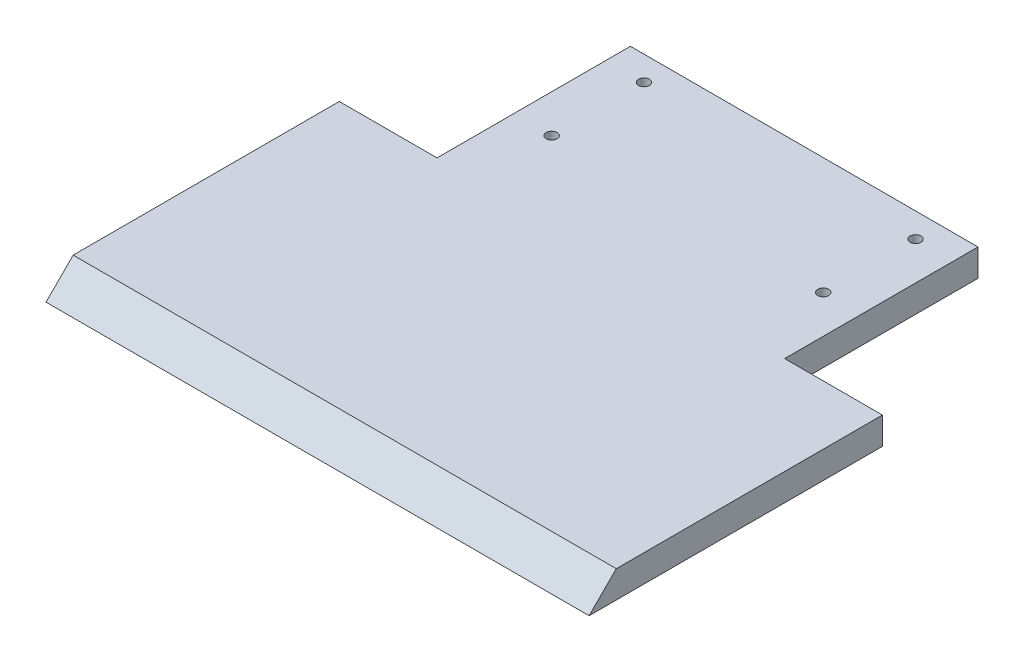
ISO-10303-21;
HEADER;
FILE_DESCRIPTION(('STEP AP214'),'2;1');
FILE_NAME('part.step','',(''),(''),'','','');
FILE_SCHEMA(('AUTOMOTIVE_DESIGN { 1 0 10303 214 1 1 1 1 }'));
ENDSEC;
DATA;
#1=APPLICATION_CONTEXT('core data for automotive mechanical design processes');
#2=APPLICATION_PROTOCOL_DEFINITION('international standard','automotive_design',2000,#1);
#3=PRODUCT_CONTEXT('',#1,'mechanical');
#4=PRODUCT('Part','Part','',(#3));
#5=PRODUCT_RELATED_PRODUCT_CATEGORY('part','',(#4));
#6=PRODUCT_DEFINITION_FORMATION('','',#4);
#7=PRODUCT_DEFINITION_CONTEXT('part definition',#1,'design');
#8=PRODUCT_DEFINITION('design','',#6,#7);
#9=PRODUCT_DEFINITION_SHAPE('','',#8);
#10=(LENGTH_UNIT() NAMED_UNIT(*) SI_UNIT(.MILLI.,.METRE.));
#11=(NAMED_UNIT(*) PLANE_ANGLE_UNIT() SI_UNIT($,.RADIAN.));
#12=(NAMED_UNIT(*) SI_UNIT($,.STERADIAN.) SOLID_ANGLE_UNIT());
#13=UNCERTAINTY_MEASURE_WITH_UNIT(LENGTH_MEASURE(1.E-05),#10,'distance_accuracy_value','');
#14=(GEOMETRIC_REPRESENTATION_CONTEXT(3) GLOBAL_UNCERTAINTY_ASSIGNED_CONTEXT((#13)) GLOBAL_UNIT_ASSIGNED_CONTEXT((#10,
#11,#12)) REPRESENTATION_CONTEXT('',''));
#15=CARTESIAN_POINT('',(0.,0.,0.));
#16=DIRECTION('',(0.,0.,1.));
#17=DIRECTION('',(1.,0.,0.));
#18=AXIS2_PLACEMENT_3D('',#15,#16,#17);
#19=CARTESIAN_POINT('',(0.,5.,0.));
#20=DIRECTION('',(1.,0.,0.));
#21=DIRECTION('',(0.,0.,-1.));
#22=AXIS2_PLACEMENT_3D('',#19,#20,#21);
#23=PLANE('',#22);
#24=DIRECTION('',(0.,0.,1.));
#25=VECTOR('',#24,1.);
#26=CARTESIAN_POINT('',(0.,5.,0.));
#27=LINE('',#26,#25);
#28=CARTESIAN_POINT('',(0.,5.,-54.));
#29=VERTEX_POINT('',#28);
#30=CARTESIAN_POINT('',(0.,5.,-5.));
#31=VERTEX_POINT('',#30);
#32=EDGE_CURVE('E134',#29,#31,#27,.T.);
#33=ORIENTED_EDGE('',*,*,#32,.F.);
#34=DIRECTION('',(0.,1.,0.));
#35=VECTOR('',#34,1.);
#36=CARTESIAN_POINT('',(0.,0.,-54.));
#37=LINE('',#36,#35);
#38=CARTESIAN_POINT('',(0.,0.,-54.));
#39=VERTEX_POINT('',#38);
#40=EDGE_CURVE('E125',#39,#29,#37,.T.);
#41=ORIENTED_EDGE('',*,*,#40,.F.);
#42=DIRECTION('',(0.,0.,1.));
#43=VECTOR('',#42,1.);
#44=CARTESIAN_POINT('',(0.,0.,0.));
#45=LINE('',#44,#43);
#46=CARTESIAN_POINT('',(0.,0.,0.));
#47=VERTEX_POINT('',#46);
#48=EDGE_CURVE('E141',#39,#47,#45,.T.);
#49=ORIENTED_EDGE('',*,*,#48,.T.);
#50=DIRECTION('',(0.,-0.707106781186549,0.707106781186547));
#51=VECTOR('',#50,1.);
#52=CARTESIAN_POINT('',(0.,5.,-5.));
#53=LINE('',#52,#51);
#54=EDGE_CURVE('E11',#47,#31,#53,.F.);
#55=ORIENTED_EDGE('',*,*,#54,.T.);
#56=EDGE_LOOP('',(#33,#41,#49,#55));
#57=FACE_BOUND('',#56,.T.);
#58=ADVANCED_FACE('F32',(#57),#23,.F.);
#59=CARTESIAN_POINT('',(100.,5.,0.));
#60=DIRECTION('',(-1.,0.,0.));
#61=DIRECTION('',(0.,0.,1.));
#62=AXIS2_PLACEMENT_3D('',#59,#60,#61);
#63=PLANE('',#62);
#64=DIRECTION('',(0.,0.,-1.));
#65=VECTOR('',#64,1.);
#66=CARTESIAN_POINT('',(100.,0.,0.));
#67=LINE('',#66,#65);
#68=CARTESIAN_POINT('',(100.,0.,0.));
#69=VERTEX_POINT('',#68);
#70=CARTESIAN_POINT('',(100.,0.,-54.));
#71=VERTEX_POINT('',#70);
#72=EDGE_CURVE('E137',#69,#71,#67,.T.);
#73=ORIENTED_EDGE('',*,*,#72,.T.);
#74=DIRECTION('',(0.,1.,0.));
#75=VECTOR('',#74,1.);
#76=CARTESIAN_POINT('',(100.,0.,-54.));
#77=LINE('',#76,#75);
#78=CARTESIAN_POINT('',(100.,5.,-54.));
#79=VERTEX_POINT('',#78);
#80=EDGE_CURVE('E129',#71,#79,#77,.T.);
#81=ORIENTED_EDGE('',*,*,#80,.T.);
#82=DIRECTION('',(0.,0.,-1.));
#83=VECTOR('',#82,1.);
#84=CARTESIAN_POINT('',(100.,5.,0.));
#85=LINE('',#84,#83);
#86=CARTESIAN_POINT('',(100.,5.,-5.));
#87=VERTEX_POINT('',#86);
#88=EDGE_CURVE('E136',#87,#79,#85,.T.);
#89=ORIENTED_EDGE('',*,*,#88,.F.);
#90=DIRECTION('',(0.,0.707106781186549,-0.707106781186547));
#91=VECTOR('',#90,1.);
#92=CARTESIAN_POINT('',(100.,5.00000000000001,-5.00000000000001));
#93=LINE('',#92,#91);
#94=EDGE_CURVE('E41',#87,#69,#93,.F.);
#95=ORIENTED_EDGE('',*,*,#94,.T.);
#96=EDGE_LOOP('',(#73,#81,#89,#95));
#97=FACE_BOUND('',#96,.T.);
#98=ADVANCED_FACE('F214',(#97),#63,.F.);
#99=CARTESIAN_POINT('',(0.,5.,0.));
#100=DIRECTION('',(0.,-1.,0.));
#101=DIRECTION('',(0.,0.,-1.));
#102=AXIS2_PLACEMENT_3D('',#99,#100,#101);
#103=PLANE('',#102);
#104=CARTESIAN_POINT('',(25.,5.,-68.1));
#105=DIRECTION('',(0.,1.,0.));
#106=DIRECTION('',(0.,0.,1.));
#107=AXIS2_PLACEMENT_3D('',#104,#105,#106);
#108=CIRCLE('',#107,1.);
#109=CARTESIAN_POINT('',(25.,5.,-67.1));
#110=VERTEX_POINT('',#109);
#111=EDGE_CURVE('E185',#110,#110,#108,.T.);
#112=ORIENTED_EDGE('',*,*,#111,.F.);
#113=EDGE_LOOP('',(#112));
#114=FACE_BOUND('',#113,.T.);
#115=CARTESIAN_POINT('',(75.,5.,-85.1));
#116=DIRECTION('',(0.,1.,0.));
#117=DIRECTION('',(0.,0.,1.));
#118=AXIS2_PLACEMENT_3D('',#115,#116,#117);
#119=CIRCLE('',#118,0.999999999999998);
#120=CARTESIAN_POINT('',(75.,5.,-84.1));
#121=VERTEX_POINT('',#120);
#122=EDGE_CURVE('E188',#121,#121,#119,.T.);
#123=ORIENTED_EDGE('',*,*,#122,.F.);
#124=EDGE_LOOP('',(#123));
#125=FACE_BOUND('',#124,.T.);
#126=CARTESIAN_POINT('',(75.,5.,-68.1));
#127=DIRECTION('',(0.,1.,0.));
#128=DIRECTION('',(0.,0.,1.));
#129=AXIS2_PLACEMENT_3D('',#126,#127,#128);
#130=CIRCLE('',#129,0.999999999999998);
#131=CARTESIAN_POINT('',(75.,5.,-67.1));
#132=VERTEX_POINT('',#131);
#133=EDGE_CURVE('E220',#132,#132,#130,.T.);
#134=ORIENTED_EDGE('',*,*,#133,.F.);
#135=EDGE_LOOP('',(#134));
#136=FACE_BOUND('',#135,.T.);
#137=CARTESIAN_POINT('',(25.,5.,-85.1));
#138=DIRECTION('',(0.,1.,0.));
#139=DIRECTION('',(0.,0.,1.));
#140=AXIS2_PLACEMENT_3D('',#137,#138,#139);
#141=CIRCLE('',#140,1.);
#142=CARTESIAN_POINT('',(25.,5.,-84.1));
#143=VERTEX_POINT('',#142);
#144=EDGE_CURVE('E156',#143,#143,#141,.T.);
#145=ORIENTED_EDGE('',*,*,#144,.F.);
#146=EDGE_LOOP('',(#145));
#147=FACE_BOUND('',#146,.T.);
#148=DIRECTION('',(0.,0.,1.));
#149=VECTOR('',#148,1.);
#150=CARTESIAN_POINT('',(82.,5.,-99.2));
#151=LINE('',#150,#149);
#152=CARTESIAN_POINT('',(82.,5.,-89.6));
#153=VERTEX_POINT('',#152);
#154=CARTESIAN_POINT('',(82.,5.,-54.));
#155=VERTEX_POINT('',#154);
#156=EDGE_CURVE('E122',#153,#155,#151,.T.);
#157=ORIENTED_EDGE('',*,*,#156,.F.);
#158=DIRECTION('',(1.,0.,0.));
#159=VECTOR('',#158,1.);
#160=CARTESIAN_POINT('',(18.,5.,-89.6));
#161=LINE('',#160,#159);
#162=CARTESIAN_POINT('',(18.,5.,-89.6));
#163=VERTEX_POINT('',#162);
#164=EDGE_CURVE('E100',#163,#153,#161,.T.);
#165=ORIENTED_EDGE('',*,*,#164,.F.);
#166=DIRECTION('',(0.,0.,-1.));
#167=VECTOR('',#166,1.);
#168=CARTESIAN_POINT('',(18.,5.,-99.2));
#169=LINE('',#168,#167);
#170=CARTESIAN_POINT('',(18.,5.,-54.));
#171=VERTEX_POINT('',#170);
#172=EDGE_CURVE('E194',#171,#163,#169,.T.);
#173=ORIENTED_EDGE('',*,*,#172,.F.);
#174=DIRECTION('',(1.,0.,0.));
#175=VECTOR('',#174,1.);
#176=CARTESIAN_POINT('',(0.,5.,-54.));
#177=LINE('',#176,#175);
#178=EDGE_CURVE('E132',#29,#171,#177,.T.);
#179=ORIENTED_EDGE('',*,*,#178,.F.);
#180=ORIENTED_EDGE('',*,*,#32,.T.);
#181=DIRECTION('',(1.,0.,0.));
#182=VECTOR('',#181,1.);
#183=CARTESIAN_POINT('',(0.,5.,-5.));
#184=LINE('',#183,#182);
#185=EDGE_CURVE('E140',#31,#87,#184,.T.);
#186=ORIENTED_EDGE('',*,*,#185,.T.);
#187=ORIENTED_EDGE('',*,*,#88,.T.);
#188=DIRECTION('',(1.,0.,0.));
#189=VECTOR('',#188,1.);
#190=CARTESIAN_POINT('',(100.,5.,-54.));
#191=LINE('',#190,#189);
#192=EDGE_CURVE('E119',#155,#79,#191,.T.);
#193=ORIENTED_EDGE('',*,*,#192,.F.);
#194=EDGE_LOOP('',(#157,#165,#173,#179,#180,#186,#187,#193));
#195=FACE_BOUND('',#194,.T.);
#196=ADVANCED_FACE('F169',(#114,#125,#136,#147,#195),#103,.F.);
#197=CARTESIAN_POINT('',(0.,0.,0.));
#198=DIRECTION('',(0.,-1.,0.));
#199=DIRECTION('',(0.,0.,-1.));
#200=AXIS2_PLACEMENT_3D('',#197,#198,#199);
#201=PLANE('',#200);
#202=DIRECTION('',(1.,0.,0.));
#203=VECTOR('',#202,1.);
#204=CARTESIAN_POINT('',(18.,0.,-89.6));
#205=LINE('',#204,#203);
#206=CARTESIAN_POINT('',(18.,0.,-89.6));
#207=VERTEX_POINT('',#206);
#208=CARTESIAN_POINT('',(82.,0.,-89.6));
#209=VERTEX_POINT('',#208);
#210=EDGE_CURVE('E49',#207,#209,#205,.T.);
#211=ORIENTED_EDGE('',*,*,#210,.T.);
#212=DIRECTION('',(0.,0.,1.));
#213=VECTOR('',#212,1.);
#214=CARTESIAN_POINT('',(82.,0.,-99.2));
#215=LINE('',#214,#213);
#216=CARTESIAN_POINT('',(82.,0.,-54.));
#217=VERTEX_POINT('',#216);
#218=EDGE_CURVE('E110',#209,#217,#215,.T.);
#219=ORIENTED_EDGE('',*,*,#218,.T.);
#220=DIRECTION('',(1.,0.,0.));
#221=VECTOR('',#220,1.);
#222=CARTESIAN_POINT('',(100.,0.,-54.));
#223=LINE('',#222,#221);
#224=EDGE_CURVE('E118',#217,#71,#223,.T.);
#225=ORIENTED_EDGE('',*,*,#224,.T.);
#226=ORIENTED_EDGE('',*,*,#72,.F.);
#227=DIRECTION('',(1.,0.,0.));
#228=VECTOR('',#227,1.);
#229=CARTESIAN_POINT('',(0.,0.,0.));
#230=LINE('',#229,#228);
#231=EDGE_CURVE('E143',#47,#69,#230,.T.);
#232=ORIENTED_EDGE('',*,*,#231,.F.);
#233=ORIENTED_EDGE('',*,*,#48,.F.);
#234=DIRECTION('',(1.,0.,0.));
#235=VECTOR('',#234,1.);
#236=CARTESIAN_POINT('',(0.,0.,-54.));
#237=LINE('',#236,#235);
#238=CARTESIAN_POINT('',(18.,0.,-54.));
#239=VERTEX_POINT('',#238);
#240=EDGE_CURVE('E192',#39,#239,#237,.T.);
#241=ORIENTED_EDGE('',*,*,#240,.T.);
#242=DIRECTION('',(0.,0.,-1.));
#243=VECTOR('',#242,1.);
#244=CARTESIAN_POINT('',(18.,0.,-99.2));
#245=LINE('',#244,#243);
#246=EDGE_CURVE('E56',#239,#207,#245,.T.);
#247=ORIENTED_EDGE('',*,*,#246,.T.);
#248=EDGE_LOOP('',(#211,#219,#225,#226,#232,#233,#241,#247));
#249=FACE_BOUND('',#248,.T.);
#250=CARTESIAN_POINT('',(25.,0.,-68.1));
#251=DIRECTION('',(0.,-1.,0.));
#252=DIRECTION('',(0.,0.,-1.));
#253=AXIS2_PLACEMENT_3D('',#250,#251,#252);
#254=CIRCLE('',#253,1.);
#255=CARTESIAN_POINT('',(25.,0.,-69.1));
#256=VERTEX_POINT('',#255);
#257=EDGE_CURVE('E36',#256,#256,#254,.T.);
#258=ORIENTED_EDGE('',*,*,#257,.F.);
#259=EDGE_LOOP('',(#258));
#260=FACE_BOUND('',#259,.T.);
#261=CARTESIAN_POINT('',(75.,0.,-85.1));
#262=DIRECTION('',(0.,-1.,0.));
#263=DIRECTION('',(0.,0.,-1.));
#264=AXIS2_PLACEMENT_3D('',#261,#262,#263);
#265=CIRCLE('',#264,0.999999999999998);
#266=CARTESIAN_POINT('',(75.,0.,-86.1));
#267=VERTEX_POINT('',#266);
#268=EDGE_CURVE('E158',#267,#267,#265,.T.);
#269=ORIENTED_EDGE('',*,*,#268,.F.);
#270=EDGE_LOOP('',(#269));
#271=FACE_BOUND('',#270,.T.);
#272=CARTESIAN_POINT('',(75.,0.,-68.1));
#273=DIRECTION('',(0.,-1.,0.));
#274=DIRECTION('',(0.,0.,-1.));
#275=AXIS2_PLACEMENT_3D('',#272,#273,#274);
#276=CIRCLE('',#275,0.999999999999998);
#277=CARTESIAN_POINT('',(75.,0.,-69.1));
#278=VERTEX_POINT('',#277);
#279=EDGE_CURVE('E155',#278,#278,#276,.T.);
#280=ORIENTED_EDGE('',*,*,#279,.F.);
#281=EDGE_LOOP('',(#280));
#282=FACE_BOUND('',#281,.T.);
#283=CARTESIAN_POINT('',(25.,0.,-85.1));
#284=DIRECTION('',(0.,-1.,0.));
#285=DIRECTION('',(0.,0.,-1.));
#286=AXIS2_PLACEMENT_3D('',#283,#284,#285);
#287=CIRCLE('',#286,1.);
#288=CARTESIAN_POINT('',(25.,0.,-86.1));
#289=VERTEX_POINT('',#288);
#290=EDGE_CURVE('E152',#289,#289,#287,.T.);
#291=ORIENTED_EDGE('',*,*,#290,.F.);
#292=EDGE_LOOP('',(#291));
#293=FACE_BOUND('',#292,.T.);
#294=ADVANCED_FACE('F107',(#249,#260,#271,#282,#293),#201,.T.);
#295=CARTESIAN_POINT('',(0.,5.,-5.));
#296=DIRECTION('',(0.,-0.707106781186547,-0.707106781186549));
#297=DIRECTION('',(1.,0.,0.));
#298=AXIS2_PLACEMENT_3D('',#295,#296,#297);
#299=PLANE('',#298);
#300=ORIENTED_EDGE('',*,*,#54,.F.);
#301=ORIENTED_EDGE('',*,*,#231,.T.);
#302=ORIENTED_EDGE('',*,*,#94,.F.);
#303=ORIENTED_EDGE('',*,*,#185,.F.);
#304=EDGE_LOOP('',(#300,#301,#302,#303));
#305=FACE_BOUND('',#304,.T.);
#306=ADVANCED_FACE('F34',(#305),#299,.F.);
#307=CARTESIAN_POINT('',(100.,0.,-54.));
#308=DIRECTION('',(0.,0.,1.));
#309=DIRECTION('',(1.,0.,0.));
#310=AXIS2_PLACEMENT_3D('',#307,#308,#309);
#311=PLANE('',#310);
#312=ORIENTED_EDGE('',*,*,#192,.T.);
#313=ORIENTED_EDGE('',*,*,#80,.F.);
#314=ORIENTED_EDGE('',*,*,#224,.F.);
#315=DIRECTION('',(0.,1.,0.));
#316=VECTOR('',#315,1.);
#317=CARTESIAN_POINT('',(82.,0.,-54.));
#318=LINE('',#317,#316);
#319=EDGE_CURVE('E117',#217,#155,#318,.T.);
#320=ORIENTED_EDGE('',*,*,#319,.T.);
#321=EDGE_LOOP('',(#312,#313,#314,#320));
#322=FACE_BOUND('',#321,.T.);
#323=ADVANCED_FACE('F217',(#322),#311,.F.);
#324=CARTESIAN_POINT('',(82.,0.,-99.2));
#325=DIRECTION('',(-1.,0.,0.));
#326=DIRECTION('',(0.,0.,1.));
#327=AXIS2_PLACEMENT_3D('',#324,#325,#326);
#328=PLANE('',#327);
#329=ORIENTED_EDGE('',*,*,#218,.F.);
#330=DIRECTION('',(0.,1.,0.));
#331=VECTOR('',#330,1.);
#332=CARTESIAN_POINT('',(82.,0.,-89.6));
#333=LINE('',#332,#331);
#334=EDGE_CURVE('E97',#209,#153,#333,.T.);
#335=ORIENTED_EDGE('',*,*,#334,.T.);
#336=ORIENTED_EDGE('',*,*,#156,.T.);
#337=ORIENTED_EDGE('',*,*,#319,.F.);
#338=EDGE_LOOP('',(#329,#335,#336,#337));
#339=FACE_BOUND('',#338,.T.);
#340=ADVANCED_FACE('F115',(#339),#328,.F.);
#341=CARTESIAN_POINT('',(18.,0.,-99.2));
#342=DIRECTION('',(1.,0.,0.));
#343=DIRECTION('',(0.,0.,-1.));
#344=AXIS2_PLACEMENT_3D('',#341,#342,#343);
#345=PLANE('',#344);
#346=ORIENTED_EDGE('',*,*,#172,.T.);
#347=DIRECTION('',(0.,1.,0.));
#348=VECTOR('',#347,1.);
#349=CARTESIAN_POINT('',(18.,0.,-89.6));
#350=LINE('',#349,#348);
#351=EDGE_CURVE('E104',#207,#163,#350,.T.);
#352=ORIENTED_EDGE('',*,*,#351,.F.);
#353=ORIENTED_EDGE('',*,*,#246,.F.);
#354=DIRECTION('',(0.,1.,0.));
#355=VECTOR('',#354,1.);
#356=CARTESIAN_POINT('',(18.,0.,-54.));
#357=LINE('',#356,#355);
#358=EDGE_CURVE('E144',#239,#171,#357,.T.);
#359=ORIENTED_EDGE('',*,*,#358,.T.);
#360=EDGE_LOOP('',(#346,#352,#353,#359));
#361=FACE_BOUND('',#360,.T.);
#362=ADVANCED_FACE('F219',(#361),#345,.F.);
#363=CARTESIAN_POINT('',(0.,0.,-54.));
#364=DIRECTION('',(0.,0.,1.));
#365=DIRECTION('',(1.,0.,0.));
#366=AXIS2_PLACEMENT_3D('',#363,#364,#365);
#367=PLANE('',#366);
#368=ORIENTED_EDGE('',*,*,#178,.T.);
#369=ORIENTED_EDGE('',*,*,#358,.F.);
#370=ORIENTED_EDGE('',*,*,#240,.F.);
#371=ORIENTED_EDGE('',*,*,#40,.T.);
#372=EDGE_LOOP('',(#368,#369,#370,#371));
#373=FACE_BOUND('',#372,.T.);
#374=ADVANCED_FACE('F180',(#373),#367,.F.);
#375=CARTESIAN_POINT('',(25.,-5.,-85.1));
#376=DIRECTION('',(0.,1.,0.));
#377=DIRECTION('',(0.,0.,1.));
#378=AXIS2_PLACEMENT_3D('',#375,#376,#377);
#379=CYLINDRICAL_SURFACE('',#378,1.);
#380=ORIENTED_EDGE('',*,*,#290,.T.);
#381=EDGE_LOOP('',(#380));
#382=FACE_BOUND('',#381,.T.);
#383=ORIENTED_EDGE('',*,*,#144,.T.);
#384=EDGE_LOOP('',(#383));
#385=FACE_BOUND('',#384,.T.);
#386=ADVANCED_FACE('F176',(#382,#385),#379,.F.);
#387=CARTESIAN_POINT('',(75.,-5.,-68.1));
#388=DIRECTION('',(0.,1.,0.));
#389=DIRECTION('',(0.,0.,1.));
#390=AXIS2_PLACEMENT_3D('',#387,#388,#389);
#391=CYLINDRICAL_SURFACE('',#390,0.999999999999998);
#392=ORIENTED_EDGE('',*,*,#279,.T.);
#393=EDGE_LOOP('',(#392));
#394=FACE_BOUND('',#393,.T.);
#395=ORIENTED_EDGE('',*,*,#133,.T.);
#396=EDGE_LOOP('',(#395));
#397=FACE_BOUND('',#396,.T.);
#398=ADVANCED_FACE('F179',(#394,#397),#391,.F.);
#399=CARTESIAN_POINT('',(75.,-5.,-85.1));
#400=DIRECTION('',(0.,1.,0.));
#401=DIRECTION('',(0.,0.,1.));
#402=AXIS2_PLACEMENT_3D('',#399,#400,#401);
#403=CYLINDRICAL_SURFACE('',#402,0.999999999999998);
#404=ORIENTED_EDGE('',*,*,#268,.T.);
#405=EDGE_LOOP('',(#404));
#406=FACE_BOUND('',#405,.T.);
#407=ORIENTED_EDGE('',*,*,#122,.T.);
#408=EDGE_LOOP('',(#407));
#409=FACE_BOUND('',#408,.T.);
#410=ADVANCED_FACE('F229',(#406,#409),#403,.F.);
#411=CARTESIAN_POINT('',(25.,-5.,-68.1));
#412=DIRECTION('',(0.,1.,0.));
#413=DIRECTION('',(0.,0.,1.));
#414=AXIS2_PLACEMENT_3D('',#411,#412,#413);
#415=CYLINDRICAL_SURFACE('',#414,1.);
#416=ORIENTED_EDGE('',*,*,#257,.T.);
#417=EDGE_LOOP('',(#416));
#418=FACE_BOUND('',#417,.T.);
#419=ORIENTED_EDGE('',*,*,#111,.T.);
#420=EDGE_LOOP('',(#419));
#421=FACE_BOUND('',#420,.T.);
#422=ADVANCED_FACE('F165',(#418,#421),#415,.F.);
#423=CARTESIAN_POINT('',(18.,0.,-89.6));
#424=DIRECTION('',(0.,0.,1.));
#425=DIRECTION('',(1.,0.,0.));
#426=AXIS2_PLACEMENT_3D('',#423,#424,#425);
#427=PLANE('',#426);
#428=ORIENTED_EDGE('',*,*,#164,.T.);
#429=ORIENTED_EDGE('',*,*,#334,.F.);
#430=ORIENTED_EDGE('',*,*,#210,.F.);
#431=ORIENTED_EDGE('',*,*,#351,.T.);
#432=EDGE_LOOP('',(#428,#429,#430,#431));
#433=FACE_BOUND('',#432,.T.);
#434=ADVANCED_FACE('F98',(#433),#427,.F.);
#435=CLOSED_SHELL('',(#58,#98,#196,#294,#306,#323,#340,#362,#374,#386,#398,#410,#422,#434));
#436=MANIFOLD_SOLID_BREP('B2',#435);
#437=ADVANCED_BREP_SHAPE_REPRESENTATION('',(#18,#436),#14);
#438=SHAPE_DEFINITION_REPRESENTATION(#9,#437);
ENDSEC;
END-ISO-10303-21;
